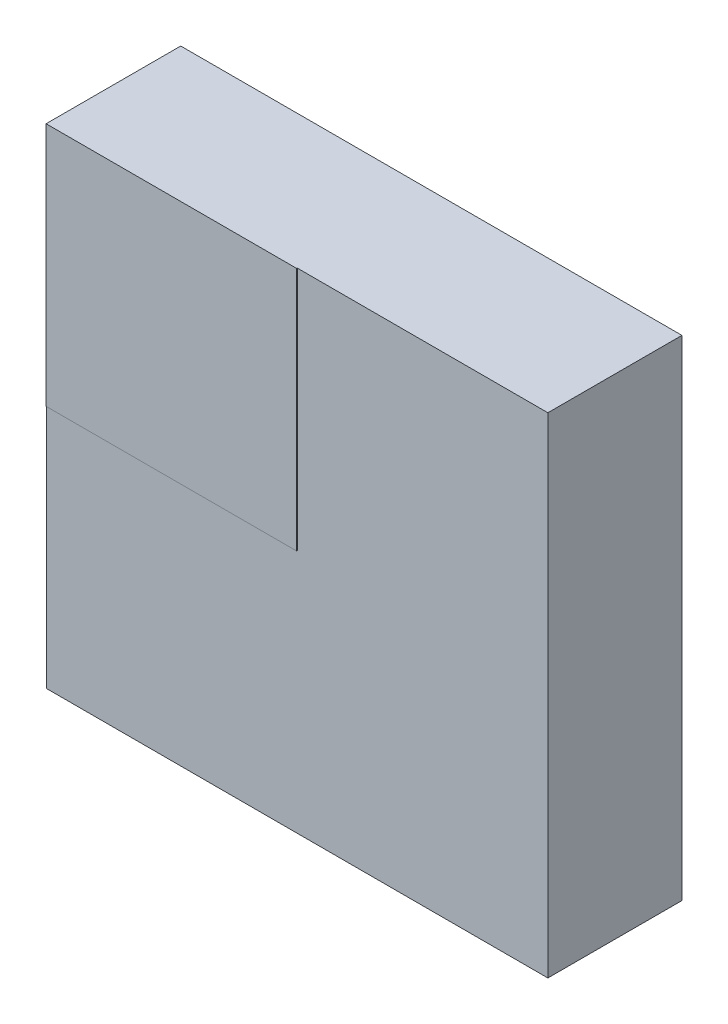
ISO-10303-21;
HEADER;
FILE_DESCRIPTION(('STEP AP214'),'2;1');
FILE_NAME('part.step','',(''),(''),'','','');
FILE_SCHEMA(('AUTOMOTIVE_DESIGN { 1 0 10303 214 1 1 1 1 }'));
ENDSEC;
DATA;
#1=APPLICATION_CONTEXT('core data for automotive mechanical design processes');
#2=APPLICATION_PROTOCOL_DEFINITION('international standard','automotive_design',2000,#1);
#3=PRODUCT_CONTEXT('',#1,'mechanical');
#4=PRODUCT('Part','Part','',(#3));
#5=PRODUCT_RELATED_PRODUCT_CATEGORY('part','',(#4));
#6=PRODUCT_DEFINITION_FORMATION('','',#4);
#7=PRODUCT_DEFINITION_CONTEXT('part definition',#1,'design');
#8=PRODUCT_DEFINITION('design','',#6,#7);
#9=PRODUCT_DEFINITION_SHAPE('','',#8);
#10=(LENGTH_UNIT() NAMED_UNIT(*) SI_UNIT(.MILLI.,.METRE.));
#11=(NAMED_UNIT(*) PLANE_ANGLE_UNIT() SI_UNIT($,.RADIAN.));
#12=(NAMED_UNIT(*) SI_UNIT($,.STERADIAN.) SOLID_ANGLE_UNIT());
#13=UNCERTAINTY_MEASURE_WITH_UNIT(LENGTH_MEASURE(1.E-05),#10,'distance_accuracy_value','');
#14=(GEOMETRIC_REPRESENTATION_CONTEXT(3) GLOBAL_UNCERTAINTY_ASSIGNED_CONTEXT((#13)) GLOBAL_UNIT_ASSIGNED_CONTEXT((#10,
#11,#12)) REPRESENTATION_CONTEXT('',''));
#15=CARTESIAN_POINT('',(0.,0.,0.));
#16=DIRECTION('',(0.,0.,1.));
#17=DIRECTION('',(1.,0.,0.));
#18=AXIS2_PLACEMENT_3D('',#15,#16,#17);
#19=CARTESIAN_POINT('',(0.,0.,0.23));
#20=DIRECTION('',(0.,0.,-1.));
#21=DIRECTION('',(-1.,0.,0.));
#22=AXIS2_PLACEMENT_3D('',#19,#20,#21);
#23=PLANE('',#22);
#24=DIRECTION('',(0.,1.,0.));
#25=VECTOR('',#24,1.);
#26=CARTESIAN_POINT('',(0.,0.42,0.23));
#27=LINE('',#26,#25);
#28=CARTESIAN_POINT('',(0.,0.,0.23));
#29=VERTEX_POINT('',#28);
#30=CARTESIAN_POINT('',(0.,0.42,0.23));
#31=VERTEX_POINT('',#30);
#32=EDGE_CURVE('E135',#29,#31,#27,.T.);
#33=ORIENTED_EDGE('',*,*,#32,.F.);
#34=DIRECTION('',(1.,0.,0.));
#35=VECTOR('',#34,1.);
#36=CARTESIAN_POINT('',(-0.43,0.,0.23));
#37=LINE('',#36,#35);
#38=CARTESIAN_POINT('',(-0.43,0.,0.23));
#39=VERTEX_POINT('',#38);
#40=EDGE_CURVE('E71',#39,#29,#37,.T.);
#41=ORIENTED_EDGE('',*,*,#40,.F.);
#42=DIRECTION('',(0.,-1.,0.));
#43=VECTOR('',#42,1.);
#44=CARTESIAN_POINT('',(-0.43,-0.42,0.23));
#45=LINE('',#44,#43);
#46=CARTESIAN_POINT('',(-0.43,-0.42,0.23));
#47=VERTEX_POINT('',#46);
#48=EDGE_CURVE('E139',#39,#47,#45,.T.);
#49=ORIENTED_EDGE('',*,*,#48,.T.);
#50=DIRECTION('',(1.,0.,0.));
#51=VECTOR('',#50,1.);
#52=CARTESIAN_POINT('',(-0.43,-0.42,0.23));
#53=LINE('',#52,#51);
#54=CARTESIAN_POINT('',(0.43,-0.42,0.23));
#55=VERTEX_POINT('',#54);
#56=EDGE_CURVE('E160',#47,#55,#53,.T.);
#57=ORIENTED_EDGE('',*,*,#56,.T.);
#58=DIRECTION('',(0.,1.,0.));
#59=VECTOR('',#58,1.);
#60=CARTESIAN_POINT('',(0.43,-0.42,0.23));
#61=LINE('',#60,#59);
#62=CARTESIAN_POINT('',(0.43,0.42,0.23));
#63=VERTEX_POINT('',#62);
#64=EDGE_CURVE('E152',#55,#63,#61,.T.);
#65=ORIENTED_EDGE('',*,*,#64,.T.);
#66=DIRECTION('',(-1.,0.,0.));
#67=VECTOR('',#66,1.);
#68=CARTESIAN_POINT('',(-0.43,0.42,0.23));
#69=LINE('',#68,#67);
#70=EDGE_CURVE('E77',#63,#31,#69,.T.);
#71=ORIENTED_EDGE('',*,*,#70,.T.);
#72=EDGE_LOOP('',(#33,#41,#49,#57,#65,#71));
#73=FACE_BOUND('',#72,.T.);
#74=ADVANCED_FACE('F49',(#73),#23,.F.);
#75=CARTESIAN_POINT('',(0.43,-0.42,0.23));
#76=DIRECTION('',(-1.,0.,0.));
#77=DIRECTION('',(0.,0.,1.));
#78=AXIS2_PLACEMENT_3D('',#75,#76,#77);
#79=PLANE('',#78);
#80=DIRECTION('',(0.,1.,0.));
#81=VECTOR('',#80,1.);
#82=CARTESIAN_POINT('',(0.43,-0.42,0.));
#83=LINE('',#82,#81);
#84=CARTESIAN_POINT('',(0.43,-0.42,0.));
#85=VERTEX_POINT('',#84);
#86=CARTESIAN_POINT('',(0.43,0.42,0.));
#87=VERTEX_POINT('',#86);
#88=EDGE_CURVE('E141',#85,#87,#83,.T.);
#89=ORIENTED_EDGE('',*,*,#88,.T.);
#90=DIRECTION('',(0.,0.,-1.));
#91=VECTOR('',#90,1.);
#92=CARTESIAN_POINT('',(0.43,0.42,0.23));
#93=LINE('',#92,#91);
#94=EDGE_CURVE('E181',#63,#87,#93,.T.);
#95=ORIENTED_EDGE('',*,*,#94,.F.);
#96=ORIENTED_EDGE('',*,*,#64,.F.);
#97=DIRECTION('',(0.,0.,-1.));
#98=VECTOR('',#97,1.);
#99=CARTESIAN_POINT('',(0.43,-0.42,0.23));
#100=LINE('',#99,#98);
#101=EDGE_CURVE('E162',#55,#85,#100,.T.);
#102=ORIENTED_EDGE('',*,*,#101,.T.);
#103=EDGE_LOOP('',(#89,#95,#96,#102));
#104=FACE_BOUND('',#103,.T.);
#105=ADVANCED_FACE('F220',(#104),#79,.F.);
#106=CARTESIAN_POINT('',(-0.43,0.42,0.23));
#107=DIRECTION('',(0.,-1.,0.));
#108=DIRECTION('',(0.,0.,-1.));
#109=AXIS2_PLACEMENT_3D('',#106,#107,#108);
#110=PLANE('',#109);
#111=DIRECTION('',(-1.,0.,0.));
#112=VECTOR('',#111,1.);
#113=CARTESIAN_POINT('',(-0.43,0.42,0.));
#114=LINE('',#113,#112);
#115=CARTESIAN_POINT('',(-0.43,0.42,0.));
#116=VERTEX_POINT('',#115);
#117=EDGE_CURVE('E146',#87,#116,#114,.T.);
#118=ORIENTED_EDGE('',*,*,#117,.T.);
#119=DIRECTION('',(0.,0.,-1.));
#120=VECTOR('',#119,1.);
#121=CARTESIAN_POINT('',(-0.43,0.42,0.23));
#122=LINE('',#121,#120);
#123=CARTESIAN_POINT('',(-0.43,0.42,0.231));
#124=VERTEX_POINT('',#123);
#125=EDGE_CURVE('E178',#124,#116,#122,.T.);
#126=ORIENTED_EDGE('',*,*,#125,.F.);
#127=DIRECTION('',(-1.,0.,0.));
#128=VECTOR('',#127,1.);
#129=CARTESIAN_POINT('',(-0.43,0.42,0.231));
#130=LINE('',#129,#128);
#131=CARTESIAN_POINT('',(0.,0.42,0.231));
#132=VERTEX_POINT('',#131);
#133=EDGE_CURVE('E131',#132,#124,#130,.T.);
#134=ORIENTED_EDGE('',*,*,#133,.F.);
#135=DIRECTION('',(0.,0.,-1.));
#136=VECTOR('',#135,1.);
#137=CARTESIAN_POINT('',(0.,0.42,0.231));
#138=LINE('',#137,#136);
#139=EDGE_CURVE('E148',#132,#31,#138,.T.);
#140=ORIENTED_EDGE('',*,*,#139,.T.);
#141=ORIENTED_EDGE('',*,*,#70,.F.);
#142=ORIENTED_EDGE('',*,*,#94,.T.);
#143=EDGE_LOOP('',(#118,#126,#134,#140,#141,#142));
#144=FACE_BOUND('',#143,.T.);
#145=ADVANCED_FACE('F230',(#144),#110,.F.);
#146=CARTESIAN_POINT('',(-0.43,-0.42,0.23));
#147=DIRECTION('',(1.,0.,0.));
#148=DIRECTION('',(0.,0.,-1.));
#149=AXIS2_PLACEMENT_3D('',#146,#147,#148);
#150=PLANE('',#149);
#151=DIRECTION('',(0.,-1.,0.));
#152=VECTOR('',#151,1.);
#153=CARTESIAN_POINT('',(-0.43,-0.42,0.));
#154=LINE('',#153,#152);
#155=CARTESIAN_POINT('',(-0.43,-0.42,0.));
#156=VERTEX_POINT('',#155);
#157=EDGE_CURVE('E166',#116,#156,#154,.T.);
#158=ORIENTED_EDGE('',*,*,#157,.T.);
#159=DIRECTION('',(0.,0.,-1.));
#160=VECTOR('',#159,1.);
#161=CARTESIAN_POINT('',(-0.43,-0.42,0.23));
#162=LINE('',#161,#160);
#163=EDGE_CURVE('E174',#47,#156,#162,.T.);
#164=ORIENTED_EDGE('',*,*,#163,.F.);
#165=ORIENTED_EDGE('',*,*,#48,.F.);
#166=DIRECTION('',(0.,0.,-1.));
#167=VECTOR('',#166,1.);
#168=CARTESIAN_POINT('',(-0.43,0.,0.231));
#169=LINE('',#168,#167);
#170=CARTESIAN_POINT('',(-0.43,0.,0.231));
#171=VERTEX_POINT('',#170);
#172=EDGE_CURVE('E118',#171,#39,#169,.T.);
#173=ORIENTED_EDGE('',*,*,#172,.F.);
#174=DIRECTION('',(0.,-1.,0.));
#175=VECTOR('',#174,1.);
#176=CARTESIAN_POINT('',(-0.43,0.42,0.231));
#177=LINE('',#176,#175);
#178=EDGE_CURVE('E125',#124,#171,#177,.T.);
#179=ORIENTED_EDGE('',*,*,#178,.F.);
#180=ORIENTED_EDGE('',*,*,#125,.T.);
#181=EDGE_LOOP('',(#158,#164,#165,#173,#179,#180));
#182=FACE_BOUND('',#181,.T.);
#183=ADVANCED_FACE('F137',(#182),#150,.F.);
#184=CARTESIAN_POINT('',(-0.43,-0.42,0.23));
#185=DIRECTION('',(0.,1.,0.));
#186=DIRECTION('',(0.,0.,1.));
#187=AXIS2_PLACEMENT_3D('',#184,#185,#186);
#188=PLANE('',#187);
#189=DIRECTION('',(1.,0.,0.));
#190=VECTOR('',#189,1.);
#191=CARTESIAN_POINT('',(-0.43,-0.42,0.));
#192=LINE('',#191,#190);
#193=EDGE_CURVE('E155',#156,#85,#192,.T.);
#194=ORIENTED_EDGE('',*,*,#193,.T.);
#195=ORIENTED_EDGE('',*,*,#101,.F.);
#196=ORIENTED_EDGE('',*,*,#56,.F.);
#197=ORIENTED_EDGE('',*,*,#163,.T.);
#198=EDGE_LOOP('',(#194,#195,#196,#197));
#199=FACE_BOUND('',#198,.T.);
#200=ADVANCED_FACE('F223',(#199),#188,.F.);
#201=CARTESIAN_POINT('',(0.,0.,0.));
#202=DIRECTION('',(0.,0.,-1.));
#203=DIRECTION('',(-1.,0.,0.));
#204=AXIS2_PLACEMENT_3D('',#201,#202,#203);
#205=PLANE('',#204);
#206=CARTESIAN_POINT('',(-0.2,-0.2,0.));
#207=DIRECTION('',(0.,0.,-1.));
#208=DIRECTION('',(-1.,0.,0.));
#209=AXIS2_PLACEMENT_3D('',#206,#207,#208);
#210=CIRCLE('',#209,0.09);
#211=CARTESIAN_POINT('',(-0.29,-0.2,0.));
#212=VERTEX_POINT('',#211);
#213=EDGE_CURVE('E337',#212,#212,#210,.T.);
#214=ORIENTED_EDGE('',*,*,#213,.F.);
#215=EDGE_LOOP('',(#214));
#216=FACE_BOUND('',#215,.T.);
#217=CARTESIAN_POINT('',(-0.2,0.2,0.));
#218=DIRECTION('',(0.,0.,-1.));
#219=DIRECTION('',(-1.,0.,0.));
#220=AXIS2_PLACEMENT_3D('',#217,#218,#219);
#221=CIRCLE('',#220,0.09);
#222=CARTESIAN_POINT('',(-0.29,0.2,0.));
#223=VERTEX_POINT('',#222);
#224=EDGE_CURVE('E339',#223,#223,#221,.T.);
#225=ORIENTED_EDGE('',*,*,#224,.F.);
#226=EDGE_LOOP('',(#225));
#227=FACE_BOUND('',#226,.T.);
#228=CARTESIAN_POINT('',(0.2,-0.2,0.));
#229=DIRECTION('',(0.,0.,-1.));
#230=DIRECTION('',(-1.,0.,0.));
#231=AXIS2_PLACEMENT_3D('',#228,#229,#230);
#232=CIRCLE('',#231,0.09);
#233=CARTESIAN_POINT('',(0.11,-0.2,0.));
#234=VERTEX_POINT('',#233);
#235=EDGE_CURVE('E343',#234,#234,#232,.T.);
#236=ORIENTED_EDGE('',*,*,#235,.F.);
#237=EDGE_LOOP('',(#236));
#238=FACE_BOUND('',#237,.T.);
#239=CARTESIAN_POINT('',(0.2,0.2,0.));
#240=DIRECTION('',(0.,0.,-1.));
#241=DIRECTION('',(-1.,0.,0.));
#242=AXIS2_PLACEMENT_3D('',#239,#240,#241);
#243=CIRCLE('',#242,0.09);
#244=CARTESIAN_POINT('',(0.11,0.2,0.));
#245=VERTEX_POINT('',#244);
#246=EDGE_CURVE('E349',#245,#245,#243,.T.);
#247=ORIENTED_EDGE('',*,*,#246,.F.);
#248=EDGE_LOOP('',(#247));
#249=FACE_BOUND('',#248,.T.);
#250=ORIENTED_EDGE('',*,*,#88,.F.);
#251=ORIENTED_EDGE('',*,*,#193,.F.);
#252=ORIENTED_EDGE('',*,*,#157,.F.);
#253=ORIENTED_EDGE('',*,*,#117,.F.);
#254=EDGE_LOOP('',(#250,#251,#252,#253));
#255=FACE_BOUND('',#254,.T.);
#256=ADVANCED_FACE('F217',(#216,#227,#238,#249,#255),#205,.T.);
#257=CARTESIAN_POINT('',(-0.43,0.,0.231));
#258=DIRECTION('',(0.,1.,0.));
#259=DIRECTION('',(0.,0.,1.));
#260=AXIS2_PLACEMENT_3D('',#257,#258,#259);
#261=PLANE('',#260);
#262=ORIENTED_EDGE('',*,*,#40,.T.);
#263=DIRECTION('',(0.,0.,-1.));
#264=VECTOR('',#263,1.);
#265=CARTESIAN_POINT('',(0.,0.,0.231));
#266=LINE('',#265,#264);
#267=CARTESIAN_POINT('',(0.,0.,0.231));
#268=VERTEX_POINT('',#267);
#269=EDGE_CURVE('E120',#268,#29,#266,.T.);
#270=ORIENTED_EDGE('',*,*,#269,.F.);
#271=DIRECTION('',(1.,0.,0.));
#272=VECTOR('',#271,1.);
#273=CARTESIAN_POINT('',(-0.43,0.,0.231));
#274=LINE('',#273,#272);
#275=EDGE_CURVE('E114',#171,#268,#274,.T.);
#276=ORIENTED_EDGE('',*,*,#275,.F.);
#277=ORIENTED_EDGE('',*,*,#172,.T.);
#278=EDGE_LOOP('',(#262,#270,#276,#277));
#279=FACE_BOUND('',#278,.T.);
#280=ADVANCED_FACE('F116',(#279),#261,.F.);
#281=CARTESIAN_POINT('',(0.,0.42,0.231));
#282=DIRECTION('',(-1.,0.,0.));
#283=DIRECTION('',(0.,0.,1.));
#284=AXIS2_PLACEMENT_3D('',#281,#282,#283);
#285=PLANE('',#284);
#286=ORIENTED_EDGE('',*,*,#32,.T.);
#287=ORIENTED_EDGE('',*,*,#139,.F.);
#288=DIRECTION('',(0.,1.,0.));
#289=VECTOR('',#288,1.);
#290=CARTESIAN_POINT('',(0.,0.42,0.231));
#291=LINE('',#290,#289);
#292=EDGE_CURVE('E124',#268,#132,#291,.T.);
#293=ORIENTED_EDGE('',*,*,#292,.F.);
#294=ORIENTED_EDGE('',*,*,#269,.T.);
#295=EDGE_LOOP('',(#286,#287,#293,#294));
#296=FACE_BOUND('',#295,.T.);
#297=ADVANCED_FACE('F211',(#296),#285,.F.);
#298=CARTESIAN_POINT('',(0.,0.,0.231));
#299=DIRECTION('',(0.,0.,1.));
#300=DIRECTION('',(1.,0.,0.));
#301=AXIS2_PLACEMENT_3D('',#298,#299,#300);
#302=PLANE('',#301);
#303=ORIENTED_EDGE('',*,*,#178,.T.);
#304=ORIENTED_EDGE('',*,*,#275,.T.);
#305=ORIENTED_EDGE('',*,*,#292,.T.);
#306=ORIENTED_EDGE('',*,*,#133,.T.);
#307=EDGE_LOOP('',(#303,#304,#305,#306));
#308=FACE_BOUND('',#307,.T.);
#309=ADVANCED_FACE('F129',(#308),#302,.T.);
#310=CARTESIAN_POINT('',(0.2,0.2,-0.1));
#311=DIRECTION('',(0.,0.,1.));
#312=DIRECTION('',(1.,0.,0.));
#313=AXIS2_PLACEMENT_3D('',#310,#311,#312);
#314=CYLINDRICAL_SURFACE('',#313,0.09);
#315=CARTESIAN_POINT('',(0.11,0.2,-0.01));
#316=CARTESIAN_POINT('',(0.11,0.223522694624033,-0.01));
#317=CARTESIAN_POINT('',(0.119727332812776,0.247006553426355,-0.01));
#318=CARTESIAN_POINT('',(0.152993446573645,0.280272667187224,-0.01));
#319=CARTESIAN_POINT('',(0.176477305375967,0.29,-0.01));
#320=CARTESIAN_POINT('',(0.223522694624033,0.29,-0.01));
#321=CARTESIAN_POINT('',(0.247006553426355,0.280272667187224,-0.01));
#322=CARTESIAN_POINT('',(0.280272667187224,0.247006553426355,-0.01));
#323=CARTESIAN_POINT('',(0.29,0.223522694624033,-0.01));
#324=CARTESIAN_POINT('',(0.29,0.176477305375967,-0.01));
#325=CARTESIAN_POINT('',(0.280272667187224,0.152993446573645,-0.01));
#326=CARTESIAN_POINT('',(0.247006553426355,0.119727332812776,-0.01));
#327=CARTESIAN_POINT('',(0.223522694624033,0.11,-0.01));
#328=CARTESIAN_POINT('',(0.176477305375967,0.11,-0.01));
#329=CARTESIAN_POINT('',(0.152993446573645,0.119727332812776,-0.01));
#330=CARTESIAN_POINT('',(0.119727332812777,0.152993446573645,-0.01));
#331=CARTESIAN_POINT('',(0.11,0.176477305375967,-0.01));
#332=CARTESIAN_POINT('',(0.11,0.2,-0.01));
#333=(BOUNDED_CURVE() B_SPLINE_CURVE(3,(#315,#316,#317,#318,#319,#320,#321,#322,#323,#324,#325,
#326,#327,#328,#329,#330,#331,#332),.UNSPECIFIED.,.T.,.F.) B_SPLINE_CURVE_WITH_KNOTS((4,2,2,2,2,
2,2,2,4),(0.,0.785398163397448,1.5707963267949,2.35619449019234,3.14159265358979,
3.92699081698724,4.71238898038469,5.49778714378214,6.28318530717959),
.UNSPECIFIED.) CURVE() GEOMETRIC_REPRESENTATION_ITEM() RATIONAL_B_SPLINE_CURVE((1.,1.,1.,1.,1.,
1.,1.,1.,1.,1.,1.,1.,1.,1.,1.,1.,1.,1.)) REPRESENTATION_ITEM(''));
#334=CARTESIAN_POINT('',(0.11,0.2,-0.01));
#335=VERTEX_POINT('',#334);
#336=EDGE_CURVE('E185',#335,#335,#333,.F.);
#337=ORIENTED_EDGE('',*,*,#336,.T.);
#338=EDGE_LOOP('',(#337));
#339=FACE_BOUND('',#338,.T.);
#340=ORIENTED_EDGE('',*,*,#246,.T.);
#341=EDGE_LOOP('',(#340));
#342=FACE_BOUND('',#341,.T.);
#343=ADVANCED_FACE('F195',(#339,#342),#314,.T.);
#344=CARTESIAN_POINT('',(0.2,0.2,-0.1));
#345=CARTESIAN_POINT('',(0.2,0.2,-0.1));
#346=CARTESIAN_POINT('',(0.2,0.2,-0.1));
#347=CARTESIAN_POINT('',(0.2,0.2,-0.1));
#348=CARTESIAN_POINT('',(0.2,0.2,-0.1));
#349=CARTESIAN_POINT('',(0.2,0.2,-0.1));
#350=CARTESIAN_POINT('',(0.2,0.2,-0.1));
#351=CARTESIAN_POINT('',(0.2,0.2,-0.1));
#352=CARTESIAN_POINT('',(0.2,0.2,-0.1));
#353=CARTESIAN_POINT('',(0.2,0.2,-0.1));
#354=CARTESIAN_POINT('',(0.2,0.2,-0.1));
#355=CARTESIAN_POINT('',(0.2,0.2,-0.1));
#356=CARTESIAN_POINT('',(0.2,0.2,-0.1));
#357=CARTESIAN_POINT('',(0.2,0.2,-0.1));
#358=CARTESIAN_POINT('',(0.2,0.2,-0.1));
#359=CARTESIAN_POINT('',(0.2,0.2,-0.1));
#360=CARTESIAN_POINT('',(0.2,0.2,-0.1));
#361=CARTESIAN_POINT('',(0.2,0.2,-0.1));
#362=CARTESIAN_POINT('',(0.11,0.2,-0.1));
#363=CARTESIAN_POINT('',(0.11,0.223522694624033,-0.1));
#364=CARTESIAN_POINT('',(0.119727332812776,0.247006553426355,-0.1));
#365=CARTESIAN_POINT('',(0.152993446573645,0.280272667187224,-0.1));
#366=CARTESIAN_POINT('',(0.176477305375967,0.29,-0.1));
#367=CARTESIAN_POINT('',(0.223522694624033,0.29,-0.1));
#368=CARTESIAN_POINT('',(0.247006553426355,0.280272667187224,-0.1));
#369=CARTESIAN_POINT('',(0.280272667187224,0.247006553426355,-0.1));
#370=CARTESIAN_POINT('',(0.29,0.223522694624033,-0.1));
#371=CARTESIAN_POINT('',(0.29,0.176477305375967,-0.1));
#372=CARTESIAN_POINT('',(0.280272667187224,0.152993446573645,-0.1));
#373=CARTESIAN_POINT('',(0.247006553426355,0.119727332812776,-0.1));
#374=CARTESIAN_POINT('',(0.223522694624033,0.11,-0.1));
#375=CARTESIAN_POINT('',(0.176477305375967,0.11,-0.1));
#376=CARTESIAN_POINT('',(0.152993446573645,0.119727332812776,-0.1));
#377=CARTESIAN_POINT('',(0.119727332812777,0.152993446573645,-0.1));
#378=CARTESIAN_POINT('',(0.11,0.176477305375967,-0.1));
#379=CARTESIAN_POINT('',(0.11,0.2,-0.1));
#380=CARTESIAN_POINT('',(0.11,0.2,-0.01));
#381=CARTESIAN_POINT('',(0.11,0.223522694624033,-0.01));
#382=CARTESIAN_POINT('',(0.119727332812776,0.247006553426355,-0.01));
#383=CARTESIAN_POINT('',(0.152993446573645,0.280272667187224,-0.01));
#384=CARTESIAN_POINT('',(0.176477305375967,0.29,-0.01));
#385=CARTESIAN_POINT('',(0.223522694624033,0.29,-0.01));
#386=CARTESIAN_POINT('',(0.247006553426355,0.280272667187224,-0.01));
#387=CARTESIAN_POINT('',(0.280272667187224,0.247006553426355,-0.01));
#388=CARTESIAN_POINT('',(0.29,0.223522694624033,-0.01));
#389=CARTESIAN_POINT('',(0.29,0.176477305375967,-0.01));
#390=CARTESIAN_POINT('',(0.280272667187224,0.152993446573645,-0.01));
#391=CARTESIAN_POINT('',(0.247006553426355,0.119727332812776,-0.01));
#392=CARTESIAN_POINT('',(0.223522694624033,0.11,-0.01));
#393=CARTESIAN_POINT('',(0.176477305375967,0.11,-0.01));
#394=CARTESIAN_POINT('',(0.152993446573645,0.119727332812776,-0.01));
#395=CARTESIAN_POINT('',(0.119727332812777,0.152993446573645,-0.01));
#396=CARTESIAN_POINT('',(0.11,0.176477305375967,-0.01));
#397=CARTESIAN_POINT('',(0.11,0.2,-0.01));
#398=(BOUNDED_SURFACE() B_SPLINE_SURFACE(2,3,((#344,#345,#346,#347,#348,#349,#350,#351,#352,
#353,#354,#355,#356,#357,#358,#359,#360,#361),(#362,#363,#364,#365,#366,#367,#368,#369,#370,
#371,#372,#373,#374,#375,#376,#377,#378,#379),(#380,#381,#382,#383,#384,#385,#386,#387,#388,
#389,#390,#391,#392,#393,#394,#395,#396,#397)),.UNSPECIFIED.,.F.,.T.,
.F.) B_SPLINE_SURFACE_WITH_KNOTS((3,3),(4,2,2,2,2,2,2,2,4),(0.,1.),(0.,0.785398163397448,
1.5707963267949,2.35619449019234,3.14159265358979,3.92699081698724,4.71238898038469,
5.49778714378214,6.28318530717959),
.UNSPECIFIED.) GEOMETRIC_REPRESENTATION_ITEM() RATIONAL_B_SPLINE_SURFACE(((1.,1.,1.,1.,1.,1.,1.,
1.,1.,1.,1.,1.,1.,1.,1.,1.,1.,1.),(1.,1.,1.,1.,1.,1.,1.,1.,1.,1.,1.,1.,1.,1.,1.,1.,1.,1.),(1.,
1.,1.,1.,1.,1.,1.,1.,1.,1.,1.,1.,1.,1.,1.,1.,1.,1.))) REPRESENTATION_ITEM('') SURFACE());
#399=ORIENTED_EDGE('',*,*,#336,.F.);
#400=EDGE_LOOP('',(#399));
#401=FACE_BOUND('',#400,.T.);
#402=ADVANCED_FACE('F205',(#401),#398,.T.);
#403=CARTESIAN_POINT('',(0.2,-0.2,-0.1));
#404=DIRECTION('',(0.,0.,1.));
#405=DIRECTION('',(1.,0.,0.));
#406=AXIS2_PLACEMENT_3D('',#403,#404,#405);
#407=CYLINDRICAL_SURFACE('',#406,0.09);
#408=CARTESIAN_POINT('',(0.11,-0.2,-0.01));
#409=CARTESIAN_POINT('',(0.11,-0.176477305375967,-0.01));
#410=CARTESIAN_POINT('',(0.119727332812776,-0.152993446573645,-0.01));
#411=CARTESIAN_POINT('',(0.152993446573645,-0.119727332812776,-0.01));
#412=CARTESIAN_POINT('',(0.176477305375967,-0.11,-0.01));
#413=CARTESIAN_POINT('',(0.223522694624033,-0.11,-0.01));
#414=CARTESIAN_POINT('',(0.247006553426355,-0.119727332812777,-0.01));
#415=CARTESIAN_POINT('',(0.280272667187224,-0.152993446573645,-0.01));
#416=CARTESIAN_POINT('',(0.29,-0.176477305375967,-0.01));
#417=CARTESIAN_POINT('',(0.29,-0.223522694624033,-0.01));
#418=CARTESIAN_POINT('',(0.280272667187224,-0.247006553426355,-0.01));
#419=CARTESIAN_POINT('',(0.247006553426355,-0.280272667187224,-0.01));
#420=CARTESIAN_POINT('',(0.223522694624033,-0.29,-0.01));
#421=CARTESIAN_POINT('',(0.176477305375967,-0.29,-0.01));
#422=CARTESIAN_POINT('',(0.152993446573645,-0.280272667187224,-0.01));
#423=CARTESIAN_POINT('',(0.119727332812777,-0.247006553426355,-0.01));
#424=CARTESIAN_POINT('',(0.11,-0.223522694624033,-0.01));
#425=CARTESIAN_POINT('',(0.11,-0.2,-0.01));
#426=(BOUNDED_CURVE() B_SPLINE_CURVE(3,(#408,#409,#410,#411,#412,#413,#414,#415,#416,#417,#418,
#419,#420,#421,#422,#423,#424,#425),.UNSPECIFIED.,.T.,.F.) B_SPLINE_CURVE_WITH_KNOTS((4,2,2,2,2,
2,2,2,4),(0.,0.785398163397448,1.5707963267949,2.35619449019234,3.14159265358979,
3.92699081698724,4.71238898038469,5.49778714378214,6.28318530717959),
.UNSPECIFIED.) CURVE() GEOMETRIC_REPRESENTATION_ITEM() RATIONAL_B_SPLINE_CURVE((1.,1.,1.,1.,1.,
1.,1.,1.,1.,1.,1.,1.,1.,1.,1.,1.,1.,1.)) REPRESENTATION_ITEM(''));
#427=CARTESIAN_POINT('',(0.11,-0.2,-0.01));
#428=VERTEX_POINT('',#427);
#429=EDGE_CURVE('E283',#428,#428,#426,.F.);
#430=ORIENTED_EDGE('',*,*,#429,.T.);
#431=EDGE_LOOP('',(#430));
#432=FACE_BOUND('',#431,.T.);
#433=ORIENTED_EDGE('',*,*,#235,.T.);
#434=EDGE_LOOP('',(#433));
#435=FACE_BOUND('',#434,.T.);
#436=ADVANCED_FACE('F206',(#432,#435),#407,.T.);
#437=CARTESIAN_POINT('',(-0.2,0.2,-0.1));
#438=DIRECTION('',(0.,0.,1.));
#439=DIRECTION('',(1.,0.,0.));
#440=AXIS2_PLACEMENT_3D('',#437,#438,#439);
#441=CYLINDRICAL_SURFACE('',#440,0.09);
#442=CARTESIAN_POINT('',(-0.29,0.2,-0.01));
#443=CARTESIAN_POINT('',(-0.29,0.223522694624033,-0.01));
#444=CARTESIAN_POINT('',(-0.280272667187224,0.247006553426355,-0.01));
#445=CARTESIAN_POINT('',(-0.247006553426355,0.280272667187224,-0.01));
#446=CARTESIAN_POINT('',(-0.223522694624033,0.29,-0.01));
#447=CARTESIAN_POINT('',(-0.176477305375967,0.29,-0.01));
#448=CARTESIAN_POINT('',(-0.152993446573645,0.280272667187224,-0.01));
#449=CARTESIAN_POINT('',(-0.119727332812776,0.247006553426355,-0.01));
#450=CARTESIAN_POINT('',(-0.11,0.223522694624033,-0.01));
#451=CARTESIAN_POINT('',(-0.11,0.176477305375967,-0.01));
#452=CARTESIAN_POINT('',(-0.119727332812776,0.152993446573645,-0.01));
#453=CARTESIAN_POINT('',(-0.152993446573645,0.119727332812776,-0.01));
#454=CARTESIAN_POINT('',(-0.176477305375967,0.11,-0.01));
#455=CARTESIAN_POINT('',(-0.223522694624033,0.11,-0.01));
#456=CARTESIAN_POINT('',(-0.247006553426355,0.119727332812776,-0.01));
#457=CARTESIAN_POINT('',(-0.280272667187223,0.152993446573645,-0.01));
#458=CARTESIAN_POINT('',(-0.29,0.176477305375967,-0.01));
#459=CARTESIAN_POINT('',(-0.29,0.2,-0.01));
#460=(BOUNDED_CURVE() B_SPLINE_CURVE(3,(#442,#443,#444,#445,#446,#447,#448,#449,#450,#451,#452,
#453,#454,#455,#456,#457,#458,#459),.UNSPECIFIED.,.T.,.F.) B_SPLINE_CURVE_WITH_KNOTS((4,2,2,2,2,
2,2,2,4),(0.,0.785398163397448,1.5707963267949,2.35619449019234,3.14159265358979,
3.92699081698724,4.71238898038469,5.49778714378214,6.28318530717959),
.UNSPECIFIED.) CURVE() GEOMETRIC_REPRESENTATION_ITEM() RATIONAL_B_SPLINE_CURVE((1.,1.,1.,1.,1.,
1.,1.,1.,1.,1.,1.,1.,1.,1.,1.,1.,1.,1.)) REPRESENTATION_ITEM(''));
#461=CARTESIAN_POINT('',(-0.29,0.2,-0.01));
#462=VERTEX_POINT('',#461);
#463=EDGE_CURVE('E64',#462,#462,#460,.F.);
#464=ORIENTED_EDGE('',*,*,#463,.T.);
#465=EDGE_LOOP('',(#464));
#466=FACE_BOUND('',#465,.T.);
#467=ORIENTED_EDGE('',*,*,#224,.T.);
#468=EDGE_LOOP('',(#467));
#469=FACE_BOUND('',#468,.T.);
#470=ADVANCED_FACE('F310',(#466,#469),#441,.T.);
#471=CARTESIAN_POINT('',(-0.2,-0.2,-0.1));
#472=DIRECTION('',(0.,0.,1.));
#473=DIRECTION('',(1.,0.,0.));
#474=AXIS2_PLACEMENT_3D('',#471,#472,#473);
#475=CYLINDRICAL_SURFACE('',#474,0.09);
#476=CARTESIAN_POINT('',(-0.29,-0.2,-0.01));
#477=CARTESIAN_POINT('',(-0.29,-0.176477305375967,-0.01));
#478=CARTESIAN_POINT('',(-0.280272667187224,-0.152993446573645,-0.01));
#479=CARTESIAN_POINT('',(-0.247006553426355,-0.119727332812776,-0.01));
#480=CARTESIAN_POINT('',(-0.223522694624033,-0.11,-0.01));
#481=CARTESIAN_POINT('',(-0.176477305375967,-0.11,-0.01));
#482=CARTESIAN_POINT('',(-0.152993446573645,-0.119727332812776,-0.01));
#483=CARTESIAN_POINT('',(-0.119727332812776,-0.152993446573645,-0.01));
#484=CARTESIAN_POINT('',(-0.11,-0.176477305375967,-0.01));
#485=CARTESIAN_POINT('',(-0.11,-0.223522694624033,-0.01));
#486=CARTESIAN_POINT('',(-0.119727332812776,-0.247006553426355,-0.01));
#487=CARTESIAN_POINT('',(-0.152993446573645,-0.280272667187224,-0.01));
#488=CARTESIAN_POINT('',(-0.176477305375967,-0.29,-0.01));
#489=CARTESIAN_POINT('',(-0.223522694624033,-0.29,-0.01));
#490=CARTESIAN_POINT('',(-0.247006553426355,-0.280272667187224,-0.01));
#491=CARTESIAN_POINT('',(-0.280272667187223,-0.247006553426355,-0.01));
#492=CARTESIAN_POINT('',(-0.29,-0.223522694624033,-0.01));
#493=CARTESIAN_POINT('',(-0.29,-0.2,-0.01));
#494=(BOUNDED_CURVE() B_SPLINE_CURVE(3,(#476,#477,#478,#479,#480,#481,#482,#483,#484,#485,#486,
#487,#488,#489,#490,#491,#492,#493),.UNSPECIFIED.,.T.,.F.) B_SPLINE_CURVE_WITH_KNOTS((4,2,2,2,2,
2,2,2,4),(0.,0.785398163397448,1.5707963267949,2.35619449019234,3.14159265358979,
3.92699081698724,4.71238898038469,5.49778714378214,6.28318530717959),
.UNSPECIFIED.) CURVE() GEOMETRIC_REPRESENTATION_ITEM() RATIONAL_B_SPLINE_CURVE((1.,1.,1.,1.,1.,
1.,1.,1.,1.,1.,1.,1.,1.,1.,1.,1.,1.,1.)) REPRESENTATION_ITEM(''));
#495=CARTESIAN_POINT('',(-0.29,-0.2,-0.01));
#496=VERTEX_POINT('',#495);
#497=EDGE_CURVE('E12',#496,#496,#494,.F.);
#498=ORIENTED_EDGE('',*,*,#497,.T.);
#499=EDGE_LOOP('',(#498));
#500=FACE_BOUND('',#499,.T.);
#501=ORIENTED_EDGE('',*,*,#213,.T.);
#502=EDGE_LOOP('',(#501));
#503=FACE_BOUND('',#502,.T.);
#504=ADVANCED_FACE('F319',(#500,#503),#475,.T.);
#505=CARTESIAN_POINT('',(0.2,-0.2,-0.1));
#506=CARTESIAN_POINT('',(0.2,-0.2,-0.1));
#507=CARTESIAN_POINT('',(0.2,-0.2,-0.1));
#508=CARTESIAN_POINT('',(0.2,-0.2,-0.1));
#509=CARTESIAN_POINT('',(0.2,-0.2,-0.1));
#510=CARTESIAN_POINT('',(0.2,-0.2,-0.1));
#511=CARTESIAN_POINT('',(0.2,-0.2,-0.1));
#512=CARTESIAN_POINT('',(0.2,-0.2,-0.1));
#513=CARTESIAN_POINT('',(0.2,-0.2,-0.1));
#514=CARTESIAN_POINT('',(0.2,-0.2,-0.1));
#515=CARTESIAN_POINT('',(0.2,-0.2,-0.1));
#516=CARTESIAN_POINT('',(0.2,-0.2,-0.1));
#517=CARTESIAN_POINT('',(0.2,-0.2,-0.1));
#518=CARTESIAN_POINT('',(0.2,-0.2,-0.1));
#519=CARTESIAN_POINT('',(0.2,-0.2,-0.1));
#520=CARTESIAN_POINT('',(0.2,-0.2,-0.1));
#521=CARTESIAN_POINT('',(0.2,-0.2,-0.1));
#522=CARTESIAN_POINT('',(0.2,-0.2,-0.1));
#523=CARTESIAN_POINT('',(0.11,-0.2,-0.1));
#524=CARTESIAN_POINT('',(0.11,-0.176477305375967,-0.1));
#525=CARTESIAN_POINT('',(0.119727332812776,-0.152993446573645,-0.1));
#526=CARTESIAN_POINT('',(0.152993446573645,-0.119727332812776,-0.1));
#527=CARTESIAN_POINT('',(0.176477305375967,-0.11,-0.1));
#528=CARTESIAN_POINT('',(0.223522694624033,-0.11,-0.1));
#529=CARTESIAN_POINT('',(0.247006553426355,-0.119727332812776,-0.1));
#530=CARTESIAN_POINT('',(0.280272667187224,-0.152993446573645,-0.1));
#531=CARTESIAN_POINT('',(0.29,-0.176477305375967,-0.1));
#532=CARTESIAN_POINT('',(0.29,-0.223522694624033,-0.1));
#533=CARTESIAN_POINT('',(0.280272667187224,-0.247006553426355,-0.1));
#534=CARTESIAN_POINT('',(0.247006553426355,-0.280272667187224,-0.1));
#535=CARTESIAN_POINT('',(0.223522694624033,-0.29,-0.1));
#536=CARTESIAN_POINT('',(0.176477305375967,-0.29,-0.1));
#537=CARTESIAN_POINT('',(0.152993446573645,-0.280272667187224,-0.1));
#538=CARTESIAN_POINT('',(0.119727332812777,-0.247006553426355,-0.1));
#539=CARTESIAN_POINT('',(0.11,-0.223522694624033,-0.1));
#540=CARTESIAN_POINT('',(0.11,-0.2,-0.1));
#541=CARTESIAN_POINT('',(0.11,-0.2,-0.01));
#542=CARTESIAN_POINT('',(0.11,-0.176477305375967,-0.01));
#543=CARTESIAN_POINT('',(0.119727332812776,-0.152993446573645,-0.01));
#544=CARTESIAN_POINT('',(0.152993446573645,-0.119727332812776,-0.01));
#545=CARTESIAN_POINT('',(0.176477305375967,-0.11,-0.01));
#546=CARTESIAN_POINT('',(0.223522694624033,-0.11,-0.01));
#547=CARTESIAN_POINT('',(0.247006553426355,-0.119727332812777,-0.01));
#548=CARTESIAN_POINT('',(0.280272667187224,-0.152993446573645,-0.01));
#549=CARTESIAN_POINT('',(0.29,-0.176477305375967,-0.01));
#550=CARTESIAN_POINT('',(0.29,-0.223522694624033,-0.01));
#551=CARTESIAN_POINT('',(0.280272667187224,-0.247006553426355,-0.01));
#552=CARTESIAN_POINT('',(0.247006553426355,-0.280272667187224,-0.01));
#553=CARTESIAN_POINT('',(0.223522694624033,-0.29,-0.01));
#554=CARTESIAN_POINT('',(0.176477305375967,-0.29,-0.01));
#555=CARTESIAN_POINT('',(0.152993446573645,-0.280272667187224,-0.01));
#556=CARTESIAN_POINT('',(0.119727332812777,-0.247006553426355,-0.01));
#557=CARTESIAN_POINT('',(0.11,-0.223522694624033,-0.01));
#558=CARTESIAN_POINT('',(0.11,-0.2,-0.01));
#559=(BOUNDED_SURFACE() B_SPLINE_SURFACE(2,3,((#505,#506,#507,#508,#509,#510,#511,#512,#513,
#514,#515,#516,#517,#518,#519,#520,#521,#522),(#523,#524,#525,#526,#527,#528,#529,#530,#531,
#532,#533,#534,#535,#536,#537,#538,#539,#540),(#541,#542,#543,#544,#545,#546,#547,#548,#549,
#550,#551,#552,#553,#554,#555,#556,#557,#558)),.UNSPECIFIED.,.F.,.T.,
.F.) B_SPLINE_SURFACE_WITH_KNOTS((3,3),(4,2,2,2,2,2,2,2,4),(0.,1.),(0.,0.785398163397448,
1.5707963267949,2.35619449019234,3.14159265358979,3.92699081698724,4.71238898038469,
5.49778714378214,6.28318530717959),
.UNSPECIFIED.) GEOMETRIC_REPRESENTATION_ITEM() RATIONAL_B_SPLINE_SURFACE(((1.,1.,1.,1.,1.,1.,1.,
1.,1.,1.,1.,1.,1.,1.,1.,1.,1.,1.),(1.,1.,1.,1.,1.,1.,1.,1.,1.,1.,1.,1.,1.,1.,1.,1.,1.,1.),(1.,
1.,1.,1.,1.,1.,1.,1.,1.,1.,1.,1.,1.,1.,1.,1.,1.,1.))) REPRESENTATION_ITEM('') SURFACE());
#560=ORIENTED_EDGE('',*,*,#429,.F.);
#561=EDGE_LOOP('',(#560));
#562=FACE_BOUND('',#561,.T.);
#563=ADVANCED_FACE('F246',(#562),#559,.T.);
#564=CARTESIAN_POINT('',(-0.2,0.2,-0.1));
#565=CARTESIAN_POINT('',(-0.2,0.2,-0.1));
#566=CARTESIAN_POINT('',(-0.2,0.2,-0.1));
#567=CARTESIAN_POINT('',(-0.2,0.2,-0.1));
#568=CARTESIAN_POINT('',(-0.2,0.2,-0.1));
#569=CARTESIAN_POINT('',(-0.2,0.2,-0.1));
#570=CARTESIAN_POINT('',(-0.2,0.2,-0.1));
#571=CARTESIAN_POINT('',(-0.2,0.2,-0.1));
#572=CARTESIAN_POINT('',(-0.2,0.2,-0.1));
#573=CARTESIAN_POINT('',(-0.2,0.2,-0.1));
#574=CARTESIAN_POINT('',(-0.2,0.2,-0.1));
#575=CARTESIAN_POINT('',(-0.2,0.2,-0.1));
#576=CARTESIAN_POINT('',(-0.2,0.2,-0.1));
#577=CARTESIAN_POINT('',(-0.2,0.2,-0.1));
#578=CARTESIAN_POINT('',(-0.2,0.2,-0.1));
#579=CARTESIAN_POINT('',(-0.2,0.2,-0.1));
#580=CARTESIAN_POINT('',(-0.2,0.2,-0.1));
#581=CARTESIAN_POINT('',(-0.2,0.2,-0.1));
#582=CARTESIAN_POINT('',(-0.29,0.2,-0.1));
#583=CARTESIAN_POINT('',(-0.29,0.223522694624033,-0.1));
#584=CARTESIAN_POINT('',(-0.280272667187223,0.247006553426355,-0.1));
#585=CARTESIAN_POINT('',(-0.247006553426355,0.280272667187224,-0.1));
#586=CARTESIAN_POINT('',(-0.223522694624033,0.29,-0.1));
#587=CARTESIAN_POINT('',(-0.176477305375967,0.29,-0.1));
#588=CARTESIAN_POINT('',(-0.152993446573645,0.280272667187224,-0.1));
#589=CARTESIAN_POINT('',(-0.119727332812776,0.247006553426355,-0.1));
#590=CARTESIAN_POINT('',(-0.11,0.223522694624033,-0.1));
#591=CARTESIAN_POINT('',(-0.11,0.176477305375967,-0.1));
#592=CARTESIAN_POINT('',(-0.119727332812776,0.152993446573645,-0.1));
#593=CARTESIAN_POINT('',(-0.152993446573645,0.119727332812776,-0.1));
#594=CARTESIAN_POINT('',(-0.176477305375967,0.11,-0.1));
#595=CARTESIAN_POINT('',(-0.223522694624033,0.11,-0.1));
#596=CARTESIAN_POINT('',(-0.247006553426355,0.119727332812776,-0.1));
#597=CARTESIAN_POINT('',(-0.280272667187223,0.152993446573645,-0.1));
#598=CARTESIAN_POINT('',(-0.29,0.176477305375967,-0.1));
#599=CARTESIAN_POINT('',(-0.29,0.2,-0.1));
#600=CARTESIAN_POINT('',(-0.29,0.2,-0.01));
#601=CARTESIAN_POINT('',(-0.29,0.223522694624033,-0.01));
#602=CARTESIAN_POINT('',(-0.280272667187224,0.247006553426355,-0.01));
#603=CARTESIAN_POINT('',(-0.247006553426355,0.280272667187224,-0.01));
#604=CARTESIAN_POINT('',(-0.223522694624033,0.29,-0.01));
#605=CARTESIAN_POINT('',(-0.176477305375967,0.29,-0.01));
#606=CARTESIAN_POINT('',(-0.152993446573645,0.280272667187224,-0.01));
#607=CARTESIAN_POINT('',(-0.119727332812776,0.247006553426355,-0.01));
#608=CARTESIAN_POINT('',(-0.11,0.223522694624033,-0.01));
#609=CARTESIAN_POINT('',(-0.11,0.176477305375967,-0.01));
#610=CARTESIAN_POINT('',(-0.119727332812776,0.152993446573645,-0.01));
#611=CARTESIAN_POINT('',(-0.152993446573645,0.119727332812776,-0.01));
#612=CARTESIAN_POINT('',(-0.176477305375967,0.11,-0.01));
#613=CARTESIAN_POINT('',(-0.223522694624033,0.11,-0.01));
#614=CARTESIAN_POINT('',(-0.247006553426355,0.119727332812776,-0.01));
#615=CARTESIAN_POINT('',(-0.280272667187223,0.152993446573645,-0.01));
#616=CARTESIAN_POINT('',(-0.29,0.176477305375967,-0.01));
#617=CARTESIAN_POINT('',(-0.29,0.2,-0.01));
#618=(BOUNDED_SURFACE() B_SPLINE_SURFACE(2,3,((#564,#565,#566,#567,#568,#569,#570,#571,#572,
#573,#574,#575,#576,#577,#578,#579,#580,#581),(#582,#583,#584,#585,#586,#587,#588,#589,#590,
#591,#592,#593,#594,#595,#596,#597,#598,#599),(#600,#601,#602,#603,#604,#605,#606,#607,#608,
#609,#610,#611,#612,#613,#614,#615,#616,#617)),.UNSPECIFIED.,.F.,.T.,
.F.) B_SPLINE_SURFACE_WITH_KNOTS((3,3),(4,2,2,2,2,2,2,2,4),(0.,1.),(0.,0.785398163397448,
1.5707963267949,2.35619449019234,3.14159265358979,3.92699081698724,4.71238898038469,
5.49778714378214,6.28318530717959),
.UNSPECIFIED.) GEOMETRIC_REPRESENTATION_ITEM() RATIONAL_B_SPLINE_SURFACE(((1.,1.,1.,1.,1.,1.,1.,
1.,1.,1.,1.,1.,1.,1.,1.,1.,1.,1.),(1.,1.,1.,1.,1.,1.,1.,1.,1.,1.,1.,1.,1.,1.,1.,1.,1.,1.),(1.,
1.,1.,1.,1.,1.,1.,1.,1.,1.,1.,1.,1.,1.,1.,1.,1.,1.))) REPRESENTATION_ITEM('') SURFACE());
#619=ORIENTED_EDGE('',*,*,#463,.F.);
#620=EDGE_LOOP('',(#619));
#621=FACE_BOUND('',#620,.T.);
#622=ADVANCED_FACE('F398',(#621),#618,.T.);
#623=CARTESIAN_POINT('',(-0.2,-0.2,-0.1));
#624=CARTESIAN_POINT('',(-0.2,-0.2,-0.1));
#625=CARTESIAN_POINT('',(-0.2,-0.2,-0.1));
#626=CARTESIAN_POINT('',(-0.2,-0.2,-0.1));
#627=CARTESIAN_POINT('',(-0.2,-0.2,-0.1));
#628=CARTESIAN_POINT('',(-0.2,-0.2,-0.1));
#629=CARTESIAN_POINT('',(-0.2,-0.2,-0.1));
#630=CARTESIAN_POINT('',(-0.2,-0.2,-0.1));
#631=CARTESIAN_POINT('',(-0.2,-0.2,-0.1));
#632=CARTESIAN_POINT('',(-0.2,-0.2,-0.1));
#633=CARTESIAN_POINT('',(-0.2,-0.2,-0.1));
#634=CARTESIAN_POINT('',(-0.2,-0.2,-0.1));
#635=CARTESIAN_POINT('',(-0.2,-0.2,-0.1));
#636=CARTESIAN_POINT('',(-0.2,-0.2,-0.1));
#637=CARTESIAN_POINT('',(-0.2,-0.2,-0.1));
#638=CARTESIAN_POINT('',(-0.2,-0.2,-0.1));
#639=CARTESIAN_POINT('',(-0.2,-0.2,-0.1));
#640=CARTESIAN_POINT('',(-0.2,-0.2,-0.1));
#641=CARTESIAN_POINT('',(-0.29,-0.2,-0.1));
#642=CARTESIAN_POINT('',(-0.29,-0.176477305375967,-0.1));
#643=CARTESIAN_POINT('',(-0.280272667187223,-0.152993446573645,-0.1));
#644=CARTESIAN_POINT('',(-0.247006553426355,-0.119727332812776,-0.1));
#645=CARTESIAN_POINT('',(-0.223522694624033,-0.11,-0.1));
#646=CARTESIAN_POINT('',(-0.176477305375967,-0.11,-0.1));
#647=CARTESIAN_POINT('',(-0.152993446573645,-0.119727332812776,-0.1));
#648=CARTESIAN_POINT('',(-0.119727332812776,-0.152993446573645,-0.1));
#649=CARTESIAN_POINT('',(-0.11,-0.176477305375967,-0.1));
#650=CARTESIAN_POINT('',(-0.11,-0.223522694624033,-0.1));
#651=CARTESIAN_POINT('',(-0.119727332812776,-0.247006553426355,-0.1));
#652=CARTESIAN_POINT('',(-0.152993446573645,-0.280272667187224,-0.1));
#653=CARTESIAN_POINT('',(-0.176477305375967,-0.29,-0.1));
#654=CARTESIAN_POINT('',(-0.223522694624033,-0.29,-0.1));
#655=CARTESIAN_POINT('',(-0.247006553426355,-0.280272667187224,-0.1));
#656=CARTESIAN_POINT('',(-0.280272667187223,-0.247006553426355,-0.1));
#657=CARTESIAN_POINT('',(-0.29,-0.223522694624033,-0.1));
#658=CARTESIAN_POINT('',(-0.29,-0.2,-0.1));
#659=CARTESIAN_POINT('',(-0.29,-0.2,-0.01));
#660=CARTESIAN_POINT('',(-0.29,-0.176477305375967,-0.01));
#661=CARTESIAN_POINT('',(-0.280272667187224,-0.152993446573645,-0.01));
#662=CARTESIAN_POINT('',(-0.247006553426355,-0.119727332812776,-0.01));
#663=CARTESIAN_POINT('',(-0.223522694624033,-0.11,-0.01));
#664=CARTESIAN_POINT('',(-0.176477305375967,-0.11,-0.01));
#665=CARTESIAN_POINT('',(-0.152993446573645,-0.119727332812776,-0.01));
#666=CARTESIAN_POINT('',(-0.119727332812776,-0.152993446573645,-0.01));
#667=CARTESIAN_POINT('',(-0.11,-0.176477305375967,-0.01));
#668=CARTESIAN_POINT('',(-0.11,-0.223522694624033,-0.01));
#669=CARTESIAN_POINT('',(-0.119727332812776,-0.247006553426355,-0.01));
#670=CARTESIAN_POINT('',(-0.152993446573645,-0.280272667187224,-0.01));
#671=CARTESIAN_POINT('',(-0.176477305375967,-0.29,-0.01));
#672=CARTESIAN_POINT('',(-0.223522694624033,-0.29,-0.01));
#673=CARTESIAN_POINT('',(-0.247006553426355,-0.280272667187224,-0.01));
#674=CARTESIAN_POINT('',(-0.280272667187223,-0.247006553426355,-0.01));
#675=CARTESIAN_POINT('',(-0.29,-0.223522694624033,-0.01));
#676=CARTESIAN_POINT('',(-0.29,-0.2,-0.01));
#677=(BOUNDED_SURFACE() B_SPLINE_SURFACE(2,3,((#623,#624,#625,#626,#627,#628,#629,#630,#631,
#632,#633,#634,#635,#636,#637,#638,#639,#640),(#641,#642,#643,#644,#645,#646,#647,#648,#649,
#650,#651,#652,#653,#654,#655,#656,#657,#658),(#659,#660,#661,#662,#663,#664,#665,#666,#667,
#668,#669,#670,#671,#672,#673,#674,#675,#676)),.UNSPECIFIED.,.F.,.T.,
.F.) B_SPLINE_SURFACE_WITH_KNOTS((3,3),(4,2,2,2,2,2,2,2,4),(0.,1.),(0.,0.785398163397448,
1.5707963267949,2.35619449019234,3.14159265358979,3.92699081698724,4.71238898038469,
5.49778714378214,6.28318530717959),
.UNSPECIFIED.) GEOMETRIC_REPRESENTATION_ITEM() RATIONAL_B_SPLINE_SURFACE(((1.,1.,1.,1.,1.,1.,1.,
1.,1.,1.,1.,1.,1.,1.,1.,1.,1.,1.),(1.,1.,1.,1.,1.,1.,1.,1.,1.,1.,1.,1.,1.,1.,1.,1.,1.,1.),(1.,
1.,1.,1.,1.,1.,1.,1.,1.,1.,1.,1.,1.,1.,1.,1.,1.,1.))) REPRESENTATION_ITEM('') SURFACE());
#678=ORIENTED_EDGE('',*,*,#497,.F.);
#679=EDGE_LOOP('',(#678));
#680=FACE_BOUND('',#679,.T.);
#681=ADVANCED_FACE('F52',(#680),#677,.T.);
#682=CLOSED_SHELL('',(#74,#105,#145,#183,#200,#256,#280,#297,#309,#343,#402,#436,#470,#504,#563,
#622,#681));
#683=MANIFOLD_SOLID_BREP('B2',#682);
#684=ADVANCED_BREP_SHAPE_REPRESENTATION('',(#18,#683),#14);
#685=SHAPE_DEFINITION_REPRESENTATION(#9,#684);
ENDSEC;
END-ISO-10303-21;
